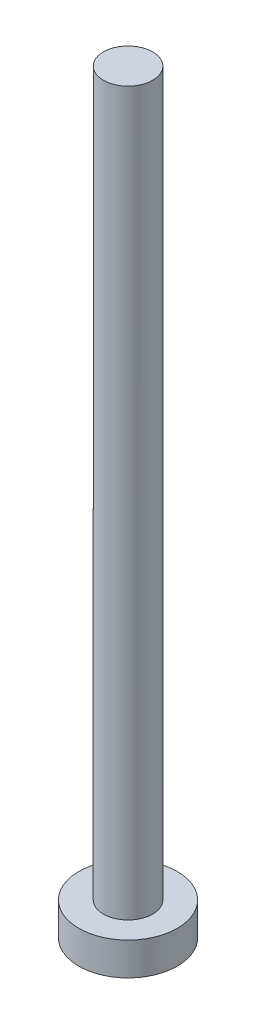
ISO-10303-21;
HEADER;
FILE_DESCRIPTION(('STEP AP214'),'2;1');
FILE_NAME('part.step','',(''),(''),'','','');
FILE_SCHEMA(('AUTOMOTIVE_DESIGN { 1 0 10303 214 1 1 1 1 }'));
ENDSEC;
DATA;
#1=APPLICATION_CONTEXT('core data for automotive mechanical design processes');
#2=APPLICATION_PROTOCOL_DEFINITION('international standard','automotive_design',2000,#1);
#3=PRODUCT_CONTEXT('',#1,'mechanical');
#4=PRODUCT('Part','Part','',(#3));
#5=PRODUCT_RELATED_PRODUCT_CATEGORY('part','',(#4));
#6=PRODUCT_DEFINITION_FORMATION('','',#4);
#7=PRODUCT_DEFINITION_CONTEXT('part definition',#1,'design');
#8=PRODUCT_DEFINITION('design','',#6,#7);
#9=PRODUCT_DEFINITION_SHAPE('','',#8);
#10=(LENGTH_UNIT() NAMED_UNIT(*) SI_UNIT(.MILLI.,.METRE.));
#11=(NAMED_UNIT(*) PLANE_ANGLE_UNIT() SI_UNIT($,.RADIAN.));
#12=(NAMED_UNIT(*) SI_UNIT($,.STERADIAN.) SOLID_ANGLE_UNIT());
#13=UNCERTAINTY_MEASURE_WITH_UNIT(LENGTH_MEASURE(1.E-05),#10,'distance_accuracy_value','');
#14=(GEOMETRIC_REPRESENTATION_CONTEXT(3) GLOBAL_UNCERTAINTY_ASSIGNED_CONTEXT((#13)) GLOBAL_UNIT_ASSIGNED_CONTEXT((#10,
#11,#12)) REPRESENTATION_CONTEXT('',''));
#15=CARTESIAN_POINT('',(0.,0.,0.));
#16=DIRECTION('',(0.,0.,1.));
#17=DIRECTION('',(1.,0.,0.));
#18=AXIS2_PLACEMENT_3D('',#15,#16,#17);
#19=CARTESIAN_POINT('',(0.,46.,0.));
#20=DIRECTION('',(0.,-1.,0.));
#21=DIRECTION('',(0.,0.,-1.));
#22=AXIS2_PLACEMENT_3D('',#19,#20,#21);
#23=CYLINDRICAL_SURFACE('',#22,1.5);
#24=CARTESIAN_POINT('',(0.,46.,0.));
#25=DIRECTION('',(0.,1.,0.));
#26=DIRECTION('',(0.,0.,1.));
#27=AXIS2_PLACEMENT_3D('',#24,#25,#26);
#28=CIRCLE('',#27,1.5);
#29=CARTESIAN_POINT('',(0.,46.,1.5));
#30=VERTEX_POINT('',#29);
#31=EDGE_CURVE('E50',#30,#30,#28,.T.);
#32=ORIENTED_EDGE('',*,*,#31,.F.);
#33=EDGE_LOOP('',(#32));
#34=FACE_BOUND('',#33,.T.);
#35=CARTESIAN_POINT('',(0.,2.,0.));
#36=DIRECTION('',(0.,-1.,0.));
#37=DIRECTION('',(0.,0.,-1.));
#38=AXIS2_PLACEMENT_3D('',#35,#36,#37);
#39=CIRCLE('',#38,1.5);
#40=CARTESIAN_POINT('',(0.,2.,-1.5));
#41=VERTEX_POINT('',#40);
#42=EDGE_CURVE('E10',#41,#41,#39,.T.);
#43=ORIENTED_EDGE('',*,*,#42,.F.);
#44=EDGE_LOOP('',(#43));
#45=FACE_BOUND('',#44,.T.);
#46=ADVANCED_FACE('F43',(#34,#45),#23,.T.);
#47=CARTESIAN_POINT('',(0.,46.,0.));
#48=DIRECTION('',(0.,1.,0.));
#49=DIRECTION('',(0.,0.,1.));
#50=AXIS2_PLACEMENT_3D('',#47,#48,#49);
#51=PLANE('',#50);
#52=ORIENTED_EDGE('',*,*,#31,.T.);
#53=EDGE_LOOP('',(#52));
#54=FACE_BOUND('',#53,.T.);
#55=ADVANCED_FACE('F72',(#54),#51,.T.);
#56=CARTESIAN_POINT('',(0.,2.,0.));
#57=DIRECTION('',(0.,-1.,0.));
#58=DIRECTION('',(0.,0.,-1.));
#59=AXIS2_PLACEMENT_3D('',#56,#57,#58);
#60=CYLINDRICAL_SURFACE('',#59,3.);
#61=CARTESIAN_POINT('',(0.,2.,0.));
#62=DIRECTION('',(0.,-1.,0.));
#63=DIRECTION('',(0.,0.,-1.));
#64=AXIS2_PLACEMENT_3D('',#61,#62,#63);
#65=CIRCLE('',#64,3.);
#66=CARTESIAN_POINT('',(0.,2.,-3.));
#67=VERTEX_POINT('',#66);
#68=EDGE_CURVE('E55',#67,#67,#65,.T.);
#69=ORIENTED_EDGE('',*,*,#68,.T.);
#70=EDGE_LOOP('',(#69));
#71=FACE_BOUND('',#70,.T.);
#72=CARTESIAN_POINT('',(0.,0.,0.));
#73=DIRECTION('',(0.,-1.,0.));
#74=DIRECTION('',(0.,0.,-1.));
#75=AXIS2_PLACEMENT_3D('',#72,#73,#74);
#76=CIRCLE('',#75,3.);
#77=CARTESIAN_POINT('',(0.,0.,-3.));
#78=VERTEX_POINT('',#77);
#79=EDGE_CURVE('E60',#78,#78,#76,.T.);
#80=ORIENTED_EDGE('',*,*,#79,.F.);
#81=EDGE_LOOP('',(#80));
#82=FACE_BOUND('',#81,.T.);
#83=ADVANCED_FACE('F69',(#71,#82),#60,.T.);
#84=CARTESIAN_POINT('',(0.,2.,0.));
#85=DIRECTION('',(0.,-1.,0.));
#86=DIRECTION('',(0.,0.,-1.));
#87=AXIS2_PLACEMENT_3D('',#84,#85,#86);
#88=PLANE('',#87);
#89=ORIENTED_EDGE('',*,*,#42,.T.);
#90=EDGE_LOOP('',(#89));
#91=FACE_BOUND('',#90,.T.);
#92=ORIENTED_EDGE('',*,*,#68,.F.);
#93=EDGE_LOOP('',(#92));
#94=FACE_BOUND('',#93,.T.);
#95=ADVANCED_FACE('F71',(#91,#94),#88,.F.);
#96=CARTESIAN_POINT('',(0.,0.,0.));
#97=DIRECTION('',(0.,1.,0.));
#98=DIRECTION('',(0.,0.,1.));
#99=AXIS2_PLACEMENT_3D('',#96,#97,#98);
#100=PLANE('',#99);
#101=ORIENTED_EDGE('',*,*,#79,.T.);
#102=EDGE_LOOP('',(#101));
#103=FACE_BOUND('',#102,.T.);
#104=ADVANCED_FACE('F67',(#103),#100,.F.);
#105=CLOSED_SHELL('',(#46,#55,#83,#95,#104));
#106=MANIFOLD_SOLID_BREP('B2',#105);
#107=ADVANCED_BREP_SHAPE_REPRESENTATION('',(#18,#106),#14);
#108=SHAPE_DEFINITION_REPRESENTATION(#9,#107);
ENDSEC;
END-ISO-10303-21;
